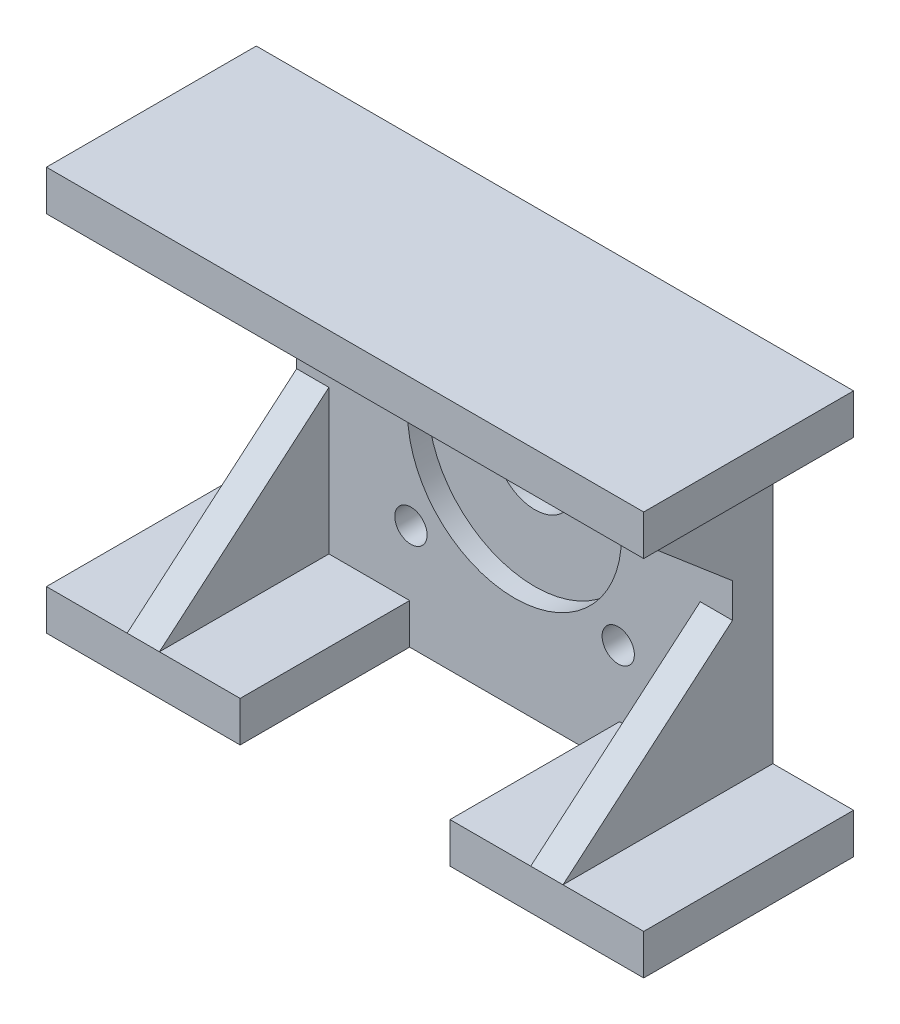
ISO-10303-21;
HEADER;
FILE_DESCRIPTION(('STEP AP214'),'2;1');
FILE_NAME('part.step','',(''),(''),'','','');
FILE_SCHEMA(('AUTOMOTIVE_DESIGN { 1 0 10303 214 1 1 1 1 }'));
ENDSEC;
DATA;
#1=APPLICATION_CONTEXT('core data for automotive mechanical design processes');
#2=APPLICATION_PROTOCOL_DEFINITION('international standard','automotive_design',2000,#1);
#3=PRODUCT_CONTEXT('',#1,'mechanical');
#4=PRODUCT('Part','Part','',(#3));
#5=PRODUCT_RELATED_PRODUCT_CATEGORY('part','',(#4));
#6=PRODUCT_DEFINITION_FORMATION('','',#4);
#7=PRODUCT_DEFINITION_CONTEXT('part definition',#1,'design');
#8=PRODUCT_DEFINITION('design','',#6,#7);
#9=PRODUCT_DEFINITION_SHAPE('','',#8);
#10=(LENGTH_UNIT() NAMED_UNIT(*) SI_UNIT(.MILLI.,.METRE.));
#11=(NAMED_UNIT(*) PLANE_ANGLE_UNIT() SI_UNIT($,.RADIAN.));
#12=(NAMED_UNIT(*) SI_UNIT($,.STERADIAN.) SOLID_ANGLE_UNIT());
#13=UNCERTAINTY_MEASURE_WITH_UNIT(LENGTH_MEASURE(1.E-05),#10,'distance_accuracy_value','');
#14=(GEOMETRIC_REPRESENTATION_CONTEXT(3) GLOBAL_UNCERTAINTY_ASSIGNED_CONTEXT((#13)) GLOBAL_UNIT_ASSIGNED_CONTEXT((#10,
#11,#12)) REPRESENTATION_CONTEXT('',''));
#15=CARTESIAN_POINT('',(0.,0.,0.));
#16=DIRECTION('',(0.,0.,1.));
#17=DIRECTION('',(1.,0.,0.));
#18=AXIS2_PLACEMENT_3D('',#15,#16,#17);
#19=CARTESIAN_POINT('',(0.,-20.,26.));
#20=DIRECTION('',(0.,1.,0.));
#21=DIRECTION('',(-1.,0.,0.));
#22=AXIS2_PLACEMENT_3D('',#19,#20,#21);
#23=PLANE('',#22);
#24=DIRECTION('',(1.,0.,0.));
#25=VECTOR('',#24,1.);
#26=CARTESIAN_POINT('',(0.,-20.,26.));
#27=LINE('',#26,#25);
#28=CARTESIAN_POINT('',(-37.,-20.,26.));
#29=VERTEX_POINT('',#28);
#30=CARTESIAN_POINT('',(-27.,-20.,26.));
#31=VERTEX_POINT('',#30);
#32=EDGE_CURVE('E220',#29,#31,#27,.T.);
#33=ORIENTED_EDGE('',*,*,#32,.T.);
#34=DIRECTION('',(0.,0.,1.));
#35=VECTOR('',#34,1.);
#36=CARTESIAN_POINT('',(-27.,-20.,0.));
#37=LINE('',#36,#35);
#38=CARTESIAN_POINT('',(-27.,-20.,0.));
#39=VERTEX_POINT('',#38);
#40=EDGE_CURVE('E304',#39,#31,#37,.T.);
#41=ORIENTED_EDGE('',*,*,#40,.F.);
#42=DIRECTION('',(1.,0.,0.));
#43=VECTOR('',#42,1.);
#44=CARTESIAN_POINT('',(0.,-20.,0.));
#45=LINE('',#44,#43);
#46=CARTESIAN_POINT('',(-37.,-20.,0.));
#47=VERTEX_POINT('',#46);
#48=EDGE_CURVE('E301',#47,#39,#45,.T.);
#49=ORIENTED_EDGE('',*,*,#48,.F.);
#50=DIRECTION('',(0.,0.,-1.));
#51=VECTOR('',#50,1.);
#52=CARTESIAN_POINT('',(-37.,-20.,26.));
#53=LINE('',#52,#51);
#54=EDGE_CURVE('E393',#29,#47,#53,.T.);
#55=ORIENTED_EDGE('',*,*,#54,.F.);
#56=EDGE_LOOP('',(#33,#41,#49,#55));
#57=FACE_BOUND('',#56,.T.);
#58=ADVANCED_FACE('F47',(#57),#23,.T.);
#59=CARTESIAN_POINT('',(0.,20.,26.));
#60=DIRECTION('',(0.,1.,0.));
#61=DIRECTION('',(0.,0.,1.));
#62=AXIS2_PLACEMENT_3D('',#59,#60,#61);
#63=PLANE('',#62);
#64=DIRECTION('',(0.,0.,1.));
#65=VECTOR('',#64,1.);
#66=CARTESIAN_POINT('',(-23.,20.,26.));
#67=LINE('',#66,#65);
#68=CARTESIAN_POINT('',(-23.,20.,5.));
#69=VERTEX_POINT('',#68);
#70=CARTESIAN_POINT('',(-23.,20.,26.));
#71=VERTEX_POINT('',#70);
#72=EDGE_CURVE('E243',#69,#71,#67,.T.);
#73=ORIENTED_EDGE('',*,*,#72,.F.);
#74=DIRECTION('',(1.,0.,0.));
#75=VECTOR('',#74,1.);
#76=CARTESIAN_POINT('',(0.,20.,5.));
#77=LINE('',#76,#75);
#78=CARTESIAN_POINT('',(23.,20.,5.));
#79=VERTEX_POINT('',#78);
#80=EDGE_CURVE('E327',#69,#79,#77,.T.);
#81=ORIENTED_EDGE('',*,*,#80,.T.);
#82=DIRECTION('',(0.,0.,1.));
#83=VECTOR('',#82,1.);
#84=CARTESIAN_POINT('',(23.,20.,26.));
#85=LINE('',#84,#83);
#86=CARTESIAN_POINT('',(23.,20.,26.));
#87=VERTEX_POINT('',#86);
#88=EDGE_CURVE('E276',#79,#87,#85,.T.);
#89=ORIENTED_EDGE('',*,*,#88,.T.);
#90=DIRECTION('',(1.,0.,0.));
#91=VECTOR('',#90,1.);
#92=CARTESIAN_POINT('',(0.,20.,26.));
#93=LINE('',#92,#91);
#94=EDGE_CURVE('E338',#71,#87,#93,.T.);
#95=ORIENTED_EDGE('',*,*,#94,.F.);
#96=EDGE_LOOP('',(#73,#81,#89,#95));
#97=FACE_BOUND('',#96,.T.);
#98=ADVANCED_FACE('F530',(#97),#63,.F.);
#99=CARTESIAN_POINT('',(0.,-20.,26.));
#100=DIRECTION('',(0.,-1.,0.));
#101=DIRECTION('',(1.,0.,0.));
#102=AXIS2_PLACEMENT_3D('',#99,#100,#101);
#103=PLANE('',#102);
#104=DIRECTION('',(0.,0.,-1.));
#105=VECTOR('',#104,1.);
#106=CARTESIAN_POINT('',(23.,-20.0000000000001,25.9999999999999));
#107=LINE('',#106,#105);
#108=CARTESIAN_POINT('',(23.,-20.,26.));
#109=VERTEX_POINT('',#108);
#110=CARTESIAN_POINT('',(23.,-20.,4.99999999999994));
#111=VERTEX_POINT('',#110);
#112=EDGE_CURVE('E272',#109,#111,#107,.T.);
#113=ORIENTED_EDGE('',*,*,#112,.T.);
#114=DIRECTION('',(-1.,0.,0.));
#115=VECTOR('',#114,1.);
#116=CARTESIAN_POINT('',(0.,-20.,5.));
#117=LINE('',#116,#115);
#118=CARTESIAN_POINT('',(13.,-20.,5.));
#119=VERTEX_POINT('',#118);
#120=EDGE_CURVE('E352',#111,#119,#117,.T.);
#121=ORIENTED_EDGE('',*,*,#120,.T.);
#122=DIRECTION('',(0.,0.,-1.));
#123=VECTOR('',#122,1.);
#124=CARTESIAN_POINT('',(13.,-20.,26.));
#125=LINE('',#124,#123);
#126=CARTESIAN_POINT('',(13.,-20.,26.));
#127=VERTEX_POINT('',#126);
#128=EDGE_CURVE('E371',#127,#119,#125,.T.);
#129=ORIENTED_EDGE('',*,*,#128,.F.);
#130=DIRECTION('',(-1.,0.,0.));
#131=VECTOR('',#130,1.);
#132=CARTESIAN_POINT('',(0.,-20.,26.));
#133=LINE('',#132,#131);
#134=EDGE_CURVE('E359',#109,#127,#133,.T.);
#135=ORIENTED_EDGE('',*,*,#134,.F.);
#136=EDGE_LOOP('',(#113,#121,#129,#135));
#137=FACE_BOUND('',#136,.T.);
#138=ADVANCED_FACE('F528',(#137),#103,.F.);
#139=CARTESIAN_POINT('',(27.,20.,26.));
#140=VERTEX_POINT('',#139);
#141=CARTESIAN_POINT('',(37.,20.,26.));
#142=VERTEX_POINT('',#141);
#143=EDGE_CURVE('E333',#140,#142,#93,.T.);
#144=ORIENTED_EDGE('',*,*,#143,.F.);
#145=DIRECTION('',(0.,0.,1.));
#146=VECTOR('',#145,1.);
#147=CARTESIAN_POINT('',(27.,20.,5.));
#148=LINE('',#147,#146);
#149=CARTESIAN_POINT('',(27.,20.,0.));
#150=VERTEX_POINT('',#149);
#151=EDGE_CURVE('E325',#150,#140,#148,.T.);
#152=ORIENTED_EDGE('',*,*,#151,.F.);
#153=DIRECTION('',(1.,0.,0.));
#154=VECTOR('',#153,1.);
#155=CARTESIAN_POINT('',(-37.,20.,0.));
#156=LINE('',#155,#154);
#157=CARTESIAN_POINT('',(37.,20.,0.));
#158=VERTEX_POINT('',#157);
#159=EDGE_CURVE('E316',#150,#158,#156,.T.);
#160=ORIENTED_EDGE('',*,*,#159,.T.);
#161=DIRECTION('',(0.,0.,-1.));
#162=VECTOR('',#161,1.);
#163=CARTESIAN_POINT('',(37.,20.,26.));
#164=LINE('',#163,#162);
#165=EDGE_CURVE('E345',#142,#158,#164,.T.);
#166=ORIENTED_EDGE('',*,*,#165,.F.);
#167=EDGE_LOOP('',(#144,#152,#160,#166));
#168=FACE_BOUND('',#167,.T.);
#169=ADVANCED_FACE('F513',(#168),#63,.F.);
#170=CARTESIAN_POINT('',(0.,0.,5.));
#171=DIRECTION('',(0.,0.,-1.));
#172=DIRECTION('',(-1.,0.,0.));
#173=AXIS2_PLACEMENT_3D('',#170,#171,#172);
#174=CYLINDRICAL_SURFACE('',#173,5.);
#175=CARTESIAN_POINT('',(0.,0.,0.));
#176=DIRECTION('',(0.,0.,1.));
#177=DIRECTION('',(1.,0.,0.));
#178=AXIS2_PLACEMENT_3D('',#175,#176,#177);
#179=CIRCLE('',#178,5.);
#180=CARTESIAN_POINT('',(5.,0.,0.));
#181=VERTEX_POINT('',#180);
#182=EDGE_CURVE('E419',#181,#181,#179,.T.);
#183=ORIENTED_EDGE('',*,*,#182,.F.);
#184=EDGE_LOOP('',(#183));
#185=FACE_BOUND('',#184,.T.);
#186=CARTESIAN_POINT('',(0.,0.,2.5));
#187=DIRECTION('',(0.,0.,1.));
#188=DIRECTION('',(1.,0.,0.));
#189=AXIS2_PLACEMENT_3D('',#186,#187,#188);
#190=CIRCLE('',#189,5.);
#191=CARTESIAN_POINT('',(5.,0.,2.5));
#192=VERTEX_POINT('',#191);
#193=EDGE_CURVE('E51',#192,#192,#190,.T.);
#194=ORIENTED_EDGE('',*,*,#193,.T.);
#195=EDGE_LOOP('',(#194));
#196=FACE_BOUND('',#195,.T.);
#197=ADVANCED_FACE('F536',(#185,#196),#174,.F.);
#198=CARTESIAN_POINT('',(-27.,25.,5.));
#199=DIRECTION('',(1.,0.,0.));
#200=DIRECTION('',(0.,1.,0.));
#201=AXIS2_PLACEMENT_3D('',#198,#199,#200);
#202=PLANE('',#201);
#203=ORIENTED_EDGE('',*,*,#40,.T.);
#204=DIRECTION('',(0.,-0.64813639465699,0.761524270080107));
#205=VECTOR('',#204,1.);
#206=CARTESIAN_POINT('',(-27.,-20.0000000000001,25.9999999999999));
#207=LINE('',#206,#205);
#208=CARTESIAN_POINT('',(-27.,-2.12681483366914,5.));
#209=VERTEX_POINT('',#208);
#210=EDGE_CURVE('E236',#209,#31,#207,.T.);
#211=ORIENTED_EDGE('',*,*,#210,.F.);
#212=DIRECTION('',(0.,-1.,0.));
#213=VECTOR('',#212,1.);
#214=CARTESIAN_POINT('',(-27.,25.,5.));
#215=LINE('',#214,#213);
#216=CARTESIAN_POINT('',(-27.,2.12681483366911,5.));
#217=VERTEX_POINT('',#216);
#218=EDGE_CURVE('E69',#217,#209,#215,.T.);
#219=ORIENTED_EDGE('',*,*,#218,.F.);
#220=DIRECTION('',(0.,-0.648136394656988,-0.761524270080108));
#221=VECTOR('',#220,1.);
#222=CARTESIAN_POINT('',(-27.,20.,26.));
#223=LINE('',#222,#221);
#224=CARTESIAN_POINT('',(-27.,20.,26.));
#225=VERTEX_POINT('',#224);
#226=EDGE_CURVE('E245',#225,#217,#223,.T.);
#227=ORIENTED_EDGE('',*,*,#226,.F.);
#228=DIRECTION('',(0.,0.,-1.));
#229=VECTOR('',#228,1.);
#230=CARTESIAN_POINT('',(-27.,20.,5.));
#231=LINE('',#230,#229);
#232=CARTESIAN_POINT('',(-27.,20.,0.));
#233=VERTEX_POINT('',#232);
#234=EDGE_CURVE('E322',#225,#233,#231,.T.);
#235=ORIENTED_EDGE('',*,*,#234,.T.);
#236=DIRECTION('',(0.,-1.,0.));
#237=VECTOR('',#236,1.);
#238=CARTESIAN_POINT('',(-27.,25.,0.));
#239=LINE('',#238,#237);
#240=EDGE_CURVE('E433',#233,#39,#239,.T.);
#241=ORIENTED_EDGE('',*,*,#240,.T.);
#242=EDGE_LOOP('',(#203,#211,#219,#227,#235,#241));
#243=FACE_BOUND('',#242,.T.);
#244=ADVANCED_FACE('F484',(#243),#202,.F.);
#245=CARTESIAN_POINT('',(0.,0.,5.));
#246=DIRECTION('',(0.,0.,1.));
#247=DIRECTION('',(1.,0.,0.));
#248=AXIS2_PLACEMENT_3D('',#245,#246,#247);
#249=PLANE('',#248);
#250=DIRECTION('',(1.,0.,0.));
#251=VECTOR('',#250,1.);
#252=CARTESIAN_POINT('',(-27.,-2.12681483366913,4.99999999999999));
#253=LINE('',#252,#251);
#254=CARTESIAN_POINT('',(-23.,-2.12681483366914,5.));
#255=VERTEX_POINT('',#254);
#256=EDGE_CURVE('E64',#209,#255,#253,.T.);
#257=ORIENTED_EDGE('',*,*,#256,.T.);
#258=DIRECTION('',(0.,1.,0.));
#259=VECTOR('',#258,1.);
#260=CARTESIAN_POINT('',(-23.,-20.,4.99999999999994));
#261=LINE('',#260,#259);
#262=CARTESIAN_POINT('',(-23.,-20.,5.));
#263=VERTEX_POINT('',#262);
#264=EDGE_CURVE('E229',#263,#255,#261,.T.);
#265=ORIENTED_EDGE('',*,*,#264,.F.);
#266=DIRECTION('',(1.,0.,0.));
#267=VECTOR('',#266,1.);
#268=CARTESIAN_POINT('',(0.,-20.,5.));
#269=LINE('',#268,#267);
#270=CARTESIAN_POINT('',(-13.,-20.,5.));
#271=VERTEX_POINT('',#270);
#272=EDGE_CURVE('E11',#263,#271,#269,.T.);
#273=ORIENTED_EDGE('',*,*,#272,.T.);
#274=DIRECTION('',(0.,-1.,0.));
#275=VECTOR('',#274,1.);
#276=CARTESIAN_POINT('',(-13.,0.,5.));
#277=LINE('',#276,#275);
#278=CARTESIAN_POINT('',(-13.,-25.,5.));
#279=VERTEX_POINT('',#278);
#280=EDGE_CURVE('E379',#271,#279,#277,.T.);
#281=ORIENTED_EDGE('',*,*,#280,.T.);
#282=DIRECTION('',(1.,0.,0.));
#283=VECTOR('',#282,1.);
#284=CARTESIAN_POINT('',(-27.,-25.,5.));
#285=LINE('',#284,#283);
#286=CARTESIAN_POINT('',(13.,-25.,5.));
#287=VERTEX_POINT('',#286);
#288=EDGE_CURVE('E56',#279,#287,#285,.T.);
#289=ORIENTED_EDGE('',*,*,#288,.T.);
#290=DIRECTION('',(0.,-1.,0.));
#291=VECTOR('',#290,1.);
#292=CARTESIAN_POINT('',(13.,0.,5.));
#293=LINE('',#292,#291);
#294=EDGE_CURVE('E357',#119,#287,#293,.T.);
#295=ORIENTED_EDGE('',*,*,#294,.F.);
#296=ORIENTED_EDGE('',*,*,#120,.F.);
#297=DIRECTION('',(0.,1.,0.));
#298=VECTOR('',#297,1.);
#299=CARTESIAN_POINT('',(23.,-20.,4.99999999999994));
#300=LINE('',#299,#298);
#301=CARTESIAN_POINT('',(23.,-2.12681483366913,4.99999999999999));
#302=VERTEX_POINT('',#301);
#303=EDGE_CURVE('E262',#111,#302,#300,.T.);
#304=ORIENTED_EDGE('',*,*,#303,.T.);
#305=DIRECTION('',(1.,0.,0.));
#306=VECTOR('',#305,1.);
#307=CARTESIAN_POINT('',(23.,-2.12681483366913,4.99999999999999));
#308=LINE('',#307,#306);
#309=CARTESIAN_POINT('',(27.,-2.12681483366913,4.99999999999999));
#310=VERTEX_POINT('',#309);
#311=EDGE_CURVE('E256',#302,#310,#308,.T.);
#312=ORIENTED_EDGE('',*,*,#311,.T.);
#313=DIRECTION('',(0.,1.,0.));
#314=VECTOR('',#313,1.);
#315=CARTESIAN_POINT('',(27.,25.,5.));
#316=LINE('',#315,#314);
#317=CARTESIAN_POINT('',(27.,2.12681483366912,5.));
#318=VERTEX_POINT('',#317);
#319=EDGE_CURVE('E425',#310,#318,#316,.T.);
#320=ORIENTED_EDGE('',*,*,#319,.T.);
#321=DIRECTION('',(1.,0.,0.));
#322=VECTOR('',#321,1.);
#323=CARTESIAN_POINT('',(23.,2.12681483366912,5.));
#324=LINE('',#323,#322);
#325=CARTESIAN_POINT('',(23.,2.12681483366912,5.));
#326=VERTEX_POINT('',#325);
#327=EDGE_CURVE('E287',#326,#318,#324,.T.);
#328=ORIENTED_EDGE('',*,*,#327,.F.);
#329=DIRECTION('',(0.,1.,0.));
#330=VECTOR('',#329,1.);
#331=CARTESIAN_POINT('',(23.,20.,5.));
#332=LINE('',#331,#330);
#333=EDGE_CURVE('E281',#326,#79,#332,.T.);
#334=ORIENTED_EDGE('',*,*,#333,.T.);
#335=ORIENTED_EDGE('',*,*,#80,.F.);
#336=DIRECTION('',(0.,1.,0.));
#337=VECTOR('',#336,1.);
#338=CARTESIAN_POINT('',(-23.,20.,5.));
#339=LINE('',#338,#337);
#340=CARTESIAN_POINT('',(-23.,2.12681483366911,5.));
#341=VERTEX_POINT('',#340);
#342=EDGE_CURVE('E248',#341,#69,#339,.T.);
#343=ORIENTED_EDGE('',*,*,#342,.F.);
#344=DIRECTION('',(1.,0.,0.));
#345=VECTOR('',#344,1.);
#346=CARTESIAN_POINT('',(-27.,2.12681483366911,5.));
#347=LINE('',#346,#345);
#348=EDGE_CURVE('E254',#217,#341,#347,.T.);
#349=ORIENTED_EDGE('',*,*,#348,.F.);
#350=ORIENTED_EDGE('',*,*,#218,.T.);
#351=EDGE_LOOP('',(#257,#265,#273,#281,#289,#295,#296,#304,#312,#320,#328,#334,#335,#343,#349,#350));
#352=FACE_BOUND('',#351,.T.);
#353=CARTESIAN_POINT('',(0.,0.,5.));
#354=DIRECTION('',(0.,0.,1.));
#355=DIRECTION('',(1.,0.,0.));
#356=AXIS2_PLACEMENT_3D('',#353,#354,#355);
#357=CIRCLE('',#356,13.25);
#358=CARTESIAN_POINT('',(13.25,0.,5.));
#359=VERTEX_POINT('',#358);
#360=EDGE_CURVE('E290',#359,#359,#357,.T.);
#361=ORIENTED_EDGE('',*,*,#360,.F.);
#362=EDGE_LOOP('',(#361));
#363=FACE_BOUND('',#362,.T.);
#364=CARTESIAN_POINT('',(12.840811795318,-11.8896405512203,5.));
#365=DIRECTION('',(0.,0.,1.));
#366=DIRECTION('',(1.,0.,0.));
#367=AXIS2_PLACEMENT_3D('',#364,#365,#366);
#368=CIRCLE('',#367,2.);
#369=CARTESIAN_POINT('',(14.840811795318,-11.8896405512203,5.));
#370=VERTEX_POINT('',#369);
#371=EDGE_CURVE('E404',#370,#370,#368,.T.);
#372=ORIENTED_EDGE('',*,*,#371,.F.);
#373=EDGE_LOOP('',(#372));
#374=FACE_BOUND('',#373,.T.);
#375=CARTESIAN_POINT('',(-12.840811795318,11.8896405512203,5.));
#376=DIRECTION('',(0.,0.,1.));
#377=DIRECTION('',(1.,0.,0.));
#378=AXIS2_PLACEMENT_3D('',#375,#376,#377);
#379=CIRCLE('',#378,2.);
#380=CARTESIAN_POINT('',(-10.840811795318,11.8896405512203,5.));
#381=VERTEX_POINT('',#380);
#382=EDGE_CURVE('E416',#381,#381,#379,.T.);
#383=ORIENTED_EDGE('',*,*,#382,.F.);
#384=EDGE_LOOP('',(#383));
#385=FACE_BOUND('',#384,.T.);
#386=CARTESIAN_POINT('',(-12.840811795318,-11.8896405512203,5.));
#387=DIRECTION('',(0.,0.,1.));
#388=DIRECTION('',(-1.,0.,0.));
#389=AXIS2_PLACEMENT_3D('',#386,#387,#388);
#390=CIRCLE('',#389,2.);
#391=CARTESIAN_POINT('',(-14.840811795318,-11.8896405512203,5.));
#392=VERTEX_POINT('',#391);
#393=EDGE_CURVE('E410',#392,#392,#390,.T.);
#394=ORIENTED_EDGE('',*,*,#393,.F.);
#395=EDGE_LOOP('',(#394));
#396=FACE_BOUND('',#395,.T.);
#397=CARTESIAN_POINT('',(12.840811795318,11.8896405512203,5.));
#398=DIRECTION('',(0.,0.,1.));
#399=DIRECTION('',(-1.,0.,0.));
#400=AXIS2_PLACEMENT_3D('',#397,#398,#399);
#401=CIRCLE('',#400,2.);
#402=CARTESIAN_POINT('',(10.840811795318,11.8896405512203,5.));
#403=VERTEX_POINT('',#402);
#404=EDGE_CURVE('E398',#403,#403,#401,.T.);
#405=ORIENTED_EDGE('',*,*,#404,.F.);
#406=EDGE_LOOP('',(#405));
#407=FACE_BOUND('',#406,.T.);
#408=ADVANCED_FACE('F471',(#352,#363,#374,#385,#396,#407),#249,.T.);
#409=CARTESIAN_POINT('',(0.,0.,0.));
#410=DIRECTION('',(0.,0.,1.));
#411=DIRECTION('',(1.,0.,0.));
#412=AXIS2_PLACEMENT_3D('',#409,#410,#411);
#413=PLANE('',#412);
#414=ORIENTED_EDGE('',*,*,#240,.F.);
#415=CARTESIAN_POINT('',(-37.,20.,0.));
#416=VERTEX_POINT('',#415);
#417=EDGE_CURVE('E317',#416,#233,#156,.T.);
#418=ORIENTED_EDGE('',*,*,#417,.F.);
#419=DIRECTION('',(0.,-1.,0.));
#420=VECTOR('',#419,1.);
#421=CARTESIAN_POINT('',(-37.,25.,0.));
#422=LINE('',#421,#420);
#423=CARTESIAN_POINT('',(-37.,25.,0.));
#424=VERTEX_POINT('',#423);
#425=EDGE_CURVE('E319',#424,#416,#422,.T.);
#426=ORIENTED_EDGE('',*,*,#425,.F.);
#427=DIRECTION('',(-1.,0.,0.));
#428=VECTOR('',#427,1.);
#429=CARTESIAN_POINT('',(-27.,25.,0.));
#430=LINE('',#429,#428);
#431=CARTESIAN_POINT('',(37.,25.,0.));
#432=VERTEX_POINT('',#431);
#433=EDGE_CURVE('E431',#432,#424,#430,.T.);
#434=ORIENTED_EDGE('',*,*,#433,.F.);
#435=DIRECTION('',(0.,-1.,0.));
#436=VECTOR('',#435,1.);
#437=CARTESIAN_POINT('',(37.,25.,0.));
#438=LINE('',#437,#436);
#439=EDGE_CURVE('E313',#432,#158,#438,.T.);
#440=ORIENTED_EDGE('',*,*,#439,.T.);
#441=ORIENTED_EDGE('',*,*,#159,.F.);
#442=DIRECTION('',(0.,1.,0.));
#443=VECTOR('',#442,1.);
#444=CARTESIAN_POINT('',(27.,25.,0.));
#445=LINE('',#444,#443);
#446=CARTESIAN_POINT('',(27.,-20.,0.));
#447=VERTEX_POINT('',#446);
#448=EDGE_CURVE('E424',#447,#150,#445,.T.);
#449=ORIENTED_EDGE('',*,*,#448,.F.);
#450=DIRECTION('',(-1.,0.,0.));
#451=VECTOR('',#450,1.);
#452=CARTESIAN_POINT('',(0.,-20.,0.));
#453=LINE('',#452,#451);
#454=CARTESIAN_POINT('',(37.,-20.,0.));
#455=VERTEX_POINT('',#454);
#456=EDGE_CURVE('E309',#455,#447,#453,.T.);
#457=ORIENTED_EDGE('',*,*,#456,.F.);
#458=DIRECTION('',(0.,1.,0.));
#459=VECTOR('',#458,1.);
#460=CARTESIAN_POINT('',(37.,0.,0.));
#461=LINE('',#460,#459);
#462=CARTESIAN_POINT('',(37.,-25.,0.));
#463=VERTEX_POINT('',#462);
#464=EDGE_CURVE('E306',#463,#455,#461,.T.);
#465=ORIENTED_EDGE('',*,*,#464,.F.);
#466=DIRECTION('',(1.,0.,0.));
#467=VECTOR('',#466,1.);
#468=CARTESIAN_POINT('',(-27.,-25.,0.));
#469=LINE('',#468,#467);
#470=CARTESIAN_POINT('',(-37.,-25.,0.));
#471=VERTEX_POINT('',#470);
#472=EDGE_CURVE('E427',#471,#463,#469,.T.);
#473=ORIENTED_EDGE('',*,*,#472,.F.);
#474=DIRECTION('',(0.,1.,0.));
#475=VECTOR('',#474,1.);
#476=CARTESIAN_POINT('',(-37.,0.,0.));
#477=LINE('',#476,#475);
#478=EDGE_CURVE('E298',#471,#47,#477,.T.);
#479=ORIENTED_EDGE('',*,*,#478,.T.);
#480=ORIENTED_EDGE('',*,*,#48,.T.);
#481=EDGE_LOOP('',(#414,#418,#426,#434,#440,#441,#449,#457,#465,#473,#479,#480));
#482=FACE_BOUND('',#481,.T.);
#483=ORIENTED_EDGE('',*,*,#182,.T.);
#484=EDGE_LOOP('',(#483));
#485=FACE_BOUND('',#484,.T.);
#486=CARTESIAN_POINT('',(-12.840811795318,11.8896405512203,0.));
#487=DIRECTION('',(0.,0.,1.));
#488=DIRECTION('',(1.,0.,0.));
#489=AXIS2_PLACEMENT_3D('',#486,#487,#488);
#490=CIRCLE('',#489,2.);
#491=CARTESIAN_POINT('',(-10.840811795318,11.8896405512203,0.));
#492=VERTEX_POINT('',#491);
#493=EDGE_CURVE('E413',#492,#492,#490,.T.);
#494=ORIENTED_EDGE('',*,*,#493,.T.);
#495=EDGE_LOOP('',(#494));
#496=FACE_BOUND('',#495,.T.);
#497=CARTESIAN_POINT('',(-12.840811795318,-11.8896405512203,0.));
#498=DIRECTION('',(0.,0.,1.));
#499=DIRECTION('',(-1.,0.,0.));
#500=AXIS2_PLACEMENT_3D('',#497,#498,#499);
#501=CIRCLE('',#500,2.);
#502=CARTESIAN_POINT('',(-14.840811795318,-11.8896405512203,0.));
#503=VERTEX_POINT('',#502);
#504=EDGE_CURVE('E407',#503,#503,#501,.T.);
#505=ORIENTED_EDGE('',*,*,#504,.T.);
#506=EDGE_LOOP('',(#505));
#507=FACE_BOUND('',#506,.T.);
#508=CARTESIAN_POINT('',(12.840811795318,-11.8896405512203,0.));
#509=DIRECTION('',(0.,0.,1.));
#510=DIRECTION('',(1.,0.,0.));
#511=AXIS2_PLACEMENT_3D('',#508,#509,#510);
#512=CIRCLE('',#511,2.);
#513=CARTESIAN_POINT('',(14.840811795318,-11.8896405512203,0.));
#514=VERTEX_POINT('',#513);
#515=EDGE_CURVE('E401',#514,#514,#512,.T.);
#516=ORIENTED_EDGE('',*,*,#515,.T.);
#517=EDGE_LOOP('',(#516));
#518=FACE_BOUND('',#517,.T.);
#519=CARTESIAN_POINT('',(12.840811795318,11.8896405512203,0.));
#520=DIRECTION('',(0.,0.,1.));
#521=DIRECTION('',(-1.,0.,0.));
#522=AXIS2_PLACEMENT_3D('',#519,#520,#521);
#523=CIRCLE('',#522,2.);
#524=CARTESIAN_POINT('',(10.840811795318,11.8896405512203,0.));
#525=VERTEX_POINT('',#524);
#526=EDGE_CURVE('E397',#525,#525,#523,.T.);
#527=ORIENTED_EDGE('',*,*,#526,.T.);
#528=EDGE_LOOP('',(#527));
#529=FACE_BOUND('',#528,.T.);
#530=ADVANCED_FACE('F447',(#482,#485,#496,#507,#518,#529),#413,.F.);
#531=CARTESIAN_POINT('',(27.,25.,5.));
#532=DIRECTION('',(-1.,0.,0.));
#533=DIRECTION('',(0.,-1.,0.));
#534=AXIS2_PLACEMENT_3D('',#531,#532,#533);
#535=PLANE('',#534);
#536=ORIENTED_EDGE('',*,*,#319,.F.);
#537=DIRECTION('',(0.,-0.64813639465699,0.761524270080107));
#538=VECTOR('',#537,1.);
#539=CARTESIAN_POINT('',(27.,-20.0000000000001,25.9999999999999));
#540=LINE('',#539,#538);
#541=CARTESIAN_POINT('',(27.,-20.0000000000001,25.9999999999999));
#542=VERTEX_POINT('',#541);
#543=EDGE_CURVE('E265',#310,#542,#540,.T.);
#544=ORIENTED_EDGE('',*,*,#543,.T.);
#545=DIRECTION('',(0.,0.,1.));
#546=VECTOR('',#545,1.);
#547=CARTESIAN_POINT('',(27.,-20.,0.));
#548=LINE('',#547,#546);
#549=EDGE_CURVE('E311',#447,#542,#548,.T.);
#550=ORIENTED_EDGE('',*,*,#549,.F.);
#551=ORIENTED_EDGE('',*,*,#448,.T.);
#552=ORIENTED_EDGE('',*,*,#151,.T.);
#553=DIRECTION('',(0.,-0.648136394656988,-0.761524270080108));
#554=VECTOR('',#553,1.);
#555=CARTESIAN_POINT('',(27.,20.,26.));
#556=LINE('',#555,#554);
#557=EDGE_CURVE('E268',#140,#318,#556,.T.);
#558=ORIENTED_EDGE('',*,*,#557,.T.);
#559=EDGE_LOOP('',(#536,#544,#550,#551,#552,#558));
#560=FACE_BOUND('',#559,.T.);
#561=ADVANCED_FACE('F49',(#560),#535,.F.);
#562=CARTESIAN_POINT('',(-27.,25.,5.));
#563=DIRECTION('',(0.,-1.,0.));
#564=DIRECTION('',(0.,0.,-1.));
#565=AXIS2_PLACEMENT_3D('',#562,#563,#564);
#566=PLANE('',#565);
#567=DIRECTION('',(0.,0.,-1.));
#568=VECTOR('',#567,1.);
#569=CARTESIAN_POINT('',(37.,25.,26.));
#570=LINE('',#569,#568);
#571=CARTESIAN_POINT('',(37.,25.,26.));
#572=VERTEX_POINT('',#571);
#573=EDGE_CURVE('E341',#572,#432,#570,.T.);
#574=ORIENTED_EDGE('',*,*,#573,.T.);
#575=ORIENTED_EDGE('',*,*,#433,.T.);
#576=DIRECTION('',(0.,0.,-1.));
#577=VECTOR('',#576,1.);
#578=CARTESIAN_POINT('',(-37.,25.,26.));
#579=LINE('',#578,#577);
#580=CARTESIAN_POINT('',(-37.,25.,26.));
#581=VERTEX_POINT('',#580);
#582=EDGE_CURVE('E349',#581,#424,#579,.T.);
#583=ORIENTED_EDGE('',*,*,#582,.F.);
#584=DIRECTION('',(-1.,0.,0.));
#585=VECTOR('',#584,1.);
#586=CARTESIAN_POINT('',(0.,25.,26.));
#587=LINE('',#586,#585);
#588=EDGE_CURVE('E328',#572,#581,#587,.T.);
#589=ORIENTED_EDGE('',*,*,#588,.F.);
#590=EDGE_LOOP('',(#574,#575,#583,#589));
#591=FACE_BOUND('',#590,.T.);
#592=ADVANCED_FACE('F506',(#591),#566,.F.);
#593=CARTESIAN_POINT('',(-27.,-25.,5.));
#594=DIRECTION('',(0.,1.,0.));
#595=DIRECTION('',(0.,0.,1.));
#596=AXIS2_PLACEMENT_3D('',#593,#594,#595);
#597=PLANE('',#596);
#598=DIRECTION('',(0.,0.,-1.));
#599=VECTOR('',#598,1.);
#600=CARTESIAN_POINT('',(-37.,-25.,26.));
#601=LINE('',#600,#599);
#602=CARTESIAN_POINT('',(-37.,-25.,26.));
#603=VERTEX_POINT('',#602);
#604=EDGE_CURVE('E390',#603,#471,#601,.T.);
#605=ORIENTED_EDGE('',*,*,#604,.T.);
#606=ORIENTED_EDGE('',*,*,#472,.T.);
#607=DIRECTION('',(0.,0.,-1.));
#608=VECTOR('',#607,1.);
#609=CARTESIAN_POINT('',(37.,-25.,26.));
#610=LINE('',#609,#608);
#611=CARTESIAN_POINT('',(37.,-25.,26.));
#612=VERTEX_POINT('',#611);
#613=EDGE_CURVE('E376',#612,#463,#610,.T.);
#614=ORIENTED_EDGE('',*,*,#613,.F.);
#615=DIRECTION('',(1.,0.,0.));
#616=VECTOR('',#615,1.);
#617=CARTESIAN_POINT('',(0.,-25.,26.));
#618=LINE('',#617,#616);
#619=CARTESIAN_POINT('',(13.,-25.,26.));
#620=VERTEX_POINT('',#619);
#621=EDGE_CURVE('E353',#620,#612,#618,.T.);
#622=ORIENTED_EDGE('',*,*,#621,.F.);
#623=DIRECTION('',(0.,0.,-1.));
#624=VECTOR('',#623,1.);
#625=CARTESIAN_POINT('',(13.,-25.,26.));
#626=LINE('',#625,#624);
#627=EDGE_CURVE('E365',#620,#287,#626,.T.);
#628=ORIENTED_EDGE('',*,*,#627,.T.);
#629=ORIENTED_EDGE('',*,*,#288,.F.);
#630=DIRECTION('',(0.,0.,-1.));
#631=VECTOR('',#630,1.);
#632=CARTESIAN_POINT('',(-13.,-25.,26.));
#633=LINE('',#632,#631);
#634=CARTESIAN_POINT('',(-13.,-25.,26.));
#635=VERTEX_POINT('',#634);
#636=EDGE_CURVE('E386',#635,#279,#633,.T.);
#637=ORIENTED_EDGE('',*,*,#636,.F.);
#638=DIRECTION('',(1.,0.,0.));
#639=VECTOR('',#638,1.);
#640=CARTESIAN_POINT('',(0.,-25.,26.));
#641=LINE('',#640,#639);
#642=EDGE_CURVE('E384',#603,#635,#641,.T.);
#643=ORIENTED_EDGE('',*,*,#642,.F.);
#644=EDGE_LOOP('',(#605,#606,#614,#622,#628,#629,#637,#643));
#645=FACE_BOUND('',#644,.T.);
#646=ADVANCED_FACE('F436',(#645),#597,.F.);
#647=CARTESIAN_POINT('',(-12.840811795318,11.8896405512203,5.));
#648=DIRECTION('',(0.,0.,-1.));
#649=DIRECTION('',(-1.,0.,0.));
#650=AXIS2_PLACEMENT_3D('',#647,#648,#649);
#651=CYLINDRICAL_SURFACE('',#650,2.);
#652=ORIENTED_EDGE('',*,*,#382,.T.);
#653=EDGE_LOOP('',(#652));
#654=FACE_BOUND('',#653,.T.);
#655=ORIENTED_EDGE('',*,*,#493,.F.);
#656=EDGE_LOOP('',(#655));
#657=FACE_BOUND('',#656,.T.);
#658=ADVANCED_FACE('F572',(#654,#657),#651,.F.);
#659=CARTESIAN_POINT('',(-12.840811795318,-11.8896405512203,5.));
#660=DIRECTION('',(0.,0.,-1.));
#661=DIRECTION('',(-1.,0.,0.));
#662=AXIS2_PLACEMENT_3D('',#659,#660,#661);
#663=CYLINDRICAL_SURFACE('',#662,2.);
#664=ORIENTED_EDGE('',*,*,#393,.T.);
#665=EDGE_LOOP('',(#664));
#666=FACE_BOUND('',#665,.T.);
#667=ORIENTED_EDGE('',*,*,#504,.F.);
#668=EDGE_LOOP('',(#667));
#669=FACE_BOUND('',#668,.T.);
#670=ADVANCED_FACE('F568',(#666,#669),#663,.F.);
#671=CARTESIAN_POINT('',(12.840811795318,-11.8896405512203,5.));
#672=DIRECTION('',(0.,0.,-1.));
#673=DIRECTION('',(-1.,0.,0.));
#674=AXIS2_PLACEMENT_3D('',#671,#672,#673);
#675=CYLINDRICAL_SURFACE('',#674,2.);
#676=ORIENTED_EDGE('',*,*,#371,.T.);
#677=EDGE_LOOP('',(#676));
#678=FACE_BOUND('',#677,.T.);
#679=ORIENTED_EDGE('',*,*,#515,.F.);
#680=EDGE_LOOP('',(#679));
#681=FACE_BOUND('',#680,.T.);
#682=ADVANCED_FACE('F562',(#678,#681),#675,.F.);
#683=CARTESIAN_POINT('',(12.840811795318,11.8896405512203,5.));
#684=DIRECTION('',(0.,0.,-1.));
#685=DIRECTION('',(-1.,0.,0.));
#686=AXIS2_PLACEMENT_3D('',#683,#684,#685);
#687=CYLINDRICAL_SURFACE('',#686,2.);
#688=ORIENTED_EDGE('',*,*,#404,.T.);
#689=EDGE_LOOP('',(#688));
#690=FACE_BOUND('',#689,.T.);
#691=ORIENTED_EDGE('',*,*,#526,.F.);
#692=EDGE_LOOP('',(#691));
#693=FACE_BOUND('',#692,.T.);
#694=ADVANCED_FACE('F557',(#690,#693),#687,.F.);
#695=CARTESIAN_POINT('',(-13.,0.,26.));
#696=DIRECTION('',(1.,0.,0.));
#697=DIRECTION('',(0.,0.,-1.));
#698=AXIS2_PLACEMENT_3D('',#695,#696,#697);
#699=PLANE('',#698);
#700=ORIENTED_EDGE('',*,*,#280,.F.);
#701=DIRECTION('',(0.,0.,-1.));
#702=VECTOR('',#701,1.);
#703=CARTESIAN_POINT('',(-13.,-20.,26.));
#704=LINE('',#703,#702);
#705=CARTESIAN_POINT('',(-13.,-20.,26.));
#706=VERTEX_POINT('',#705);
#707=EDGE_CURVE('E395',#706,#271,#704,.T.);
#708=ORIENTED_EDGE('',*,*,#707,.F.);
#709=DIRECTION('',(0.,-1.,0.));
#710=VECTOR('',#709,1.);
#711=CARTESIAN_POINT('',(-13.,0.,26.));
#712=LINE('',#711,#710);
#713=EDGE_CURVE('E216',#706,#635,#712,.T.);
#714=ORIENTED_EDGE('',*,*,#713,.T.);
#715=ORIENTED_EDGE('',*,*,#636,.T.);
#716=EDGE_LOOP('',(#700,#708,#714,#715));
#717=FACE_BOUND('',#716,.T.);
#718=ADVANCED_FACE('F475',(#717),#699,.T.);
#719=DIRECTION('',(0.,0.,-1.));
#720=VECTOR('',#719,1.);
#721=CARTESIAN_POINT('',(-23.,-20.0000000000001,25.9999999999999));
#722=LINE('',#721,#720);
#723=CARTESIAN_POINT('',(-23.,-20.0000000000001,25.9999999999999));
#724=VERTEX_POINT('',#723);
#725=EDGE_CURVE('E224',#724,#263,#722,.T.);
#726=ORIENTED_EDGE('',*,*,#725,.F.);
#727=EDGE_CURVE('E208',#724,#706,#27,.T.);
#728=ORIENTED_EDGE('',*,*,#727,.T.);
#729=ORIENTED_EDGE('',*,*,#707,.T.);
#730=ORIENTED_EDGE('',*,*,#272,.F.);
#731=EDGE_LOOP('',(#726,#728,#729,#730));
#732=FACE_BOUND('',#731,.T.);
#733=ADVANCED_FACE('F225',(#732),#23,.T.);
#734=CARTESIAN_POINT('',(-37.,0.,26.));
#735=DIRECTION('',(-1.,0.,0.));
#736=DIRECTION('',(0.,0.,1.));
#737=AXIS2_PLACEMENT_3D('',#734,#735,#736);
#738=PLANE('',#737);
#739=ORIENTED_EDGE('',*,*,#54,.T.);
#740=ORIENTED_EDGE('',*,*,#478,.F.);
#741=ORIENTED_EDGE('',*,*,#604,.F.);
#742=DIRECTION('',(0.,1.,0.));
#743=VECTOR('',#742,1.);
#744=CARTESIAN_POINT('',(-37.,0.,26.));
#745=LINE('',#744,#743);
#746=EDGE_CURVE('E381',#603,#29,#745,.T.);
#747=ORIENTED_EDGE('',*,*,#746,.T.);
#748=EDGE_LOOP('',(#739,#740,#741,#747));
#749=FACE_BOUND('',#748,.T.);
#750=ADVANCED_FACE('F478',(#749),#738,.T.);
#751=CARTESIAN_POINT('',(0.,0.,26.));
#752=DIRECTION('',(0.,0.,1.));
#753=DIRECTION('',(1.,0.,0.));
#754=AXIS2_PLACEMENT_3D('',#751,#752,#753);
#755=PLANE('',#754);
#756=ORIENTED_EDGE('',*,*,#713,.F.);
#757=ORIENTED_EDGE('',*,*,#727,.F.);
#758=DIRECTION('',(1.,0.,0.));
#759=VECTOR('',#758,1.);
#760=CARTESIAN_POINT('',(-27.,-20.0000000000001,25.9999999999999));
#761=LINE('',#760,#759);
#762=EDGE_CURVE('E213',#31,#724,#761,.T.);
#763=ORIENTED_EDGE('',*,*,#762,.F.);
#764=ORIENTED_EDGE('',*,*,#32,.F.);
#765=ORIENTED_EDGE('',*,*,#746,.F.);
#766=ORIENTED_EDGE('',*,*,#642,.T.);
#767=EDGE_LOOP('',(#756,#757,#763,#764,#765,#766));
#768=FACE_BOUND('',#767,.T.);
#769=ADVANCED_FACE('F210',(#768),#755,.T.);
#770=CARTESIAN_POINT('',(37.,0.,26.));
#771=DIRECTION('',(-1.,0.,0.));
#772=DIRECTION('',(0.,0.,1.));
#773=AXIS2_PLACEMENT_3D('',#770,#771,#772);
#774=PLANE('',#773);
#775=ORIENTED_EDGE('',*,*,#613,.T.);
#776=ORIENTED_EDGE('',*,*,#464,.T.);
#777=DIRECTION('',(0.,0.,-1.));
#778=VECTOR('',#777,1.);
#779=CARTESIAN_POINT('',(37.,-20.,26.));
#780=LINE('',#779,#778);
#781=CARTESIAN_POINT('',(37.,-20.,26.));
#782=VERTEX_POINT('',#781);
#783=EDGE_CURVE('E374',#782,#455,#780,.T.);
#784=ORIENTED_EDGE('',*,*,#783,.F.);
#785=DIRECTION('',(0.,1.,0.));
#786=VECTOR('',#785,1.);
#787=CARTESIAN_POINT('',(37.,0.,26.));
#788=LINE('',#787,#786);
#789=EDGE_CURVE('E356',#612,#782,#788,.T.);
#790=ORIENTED_EDGE('',*,*,#789,.F.);
#791=EDGE_LOOP('',(#775,#776,#784,#790));
#792=FACE_BOUND('',#791,.T.);
#793=ADVANCED_FACE('F443',(#792),#774,.F.);
#794=ORIENTED_EDGE('',*,*,#549,.T.);
#795=EDGE_CURVE('E360',#782,#542,#133,.T.);
#796=ORIENTED_EDGE('',*,*,#795,.F.);
#797=ORIENTED_EDGE('',*,*,#783,.T.);
#798=ORIENTED_EDGE('',*,*,#456,.T.);
#799=EDGE_LOOP('',(#794,#796,#797,#798));
#800=FACE_BOUND('',#799,.T.);
#801=ADVANCED_FACE('F453',(#800),#103,.F.);
#802=CARTESIAN_POINT('',(13.,0.,26.));
#803=DIRECTION('',(1.,0.,0.));
#804=DIRECTION('',(0.,0.,-1.));
#805=AXIS2_PLACEMENT_3D('',#802,#803,#804);
#806=PLANE('',#805);
#807=ORIENTED_EDGE('',*,*,#294,.T.);
#808=ORIENTED_EDGE('',*,*,#627,.F.);
#809=DIRECTION('',(0.,-1.,0.));
#810=VECTOR('',#809,1.);
#811=CARTESIAN_POINT('',(13.,0.,26.));
#812=LINE('',#811,#810);
#813=EDGE_CURVE('E363',#127,#620,#812,.T.);
#814=ORIENTED_EDGE('',*,*,#813,.F.);
#815=ORIENTED_EDGE('',*,*,#128,.T.);
#816=EDGE_LOOP('',(#807,#808,#814,#815));
#817=FACE_BOUND('',#816,.T.);
#818=ADVANCED_FACE('F467',(#817),#806,.F.);
#819=CARTESIAN_POINT('',(0.,0.,26.));
#820=DIRECTION('',(0.,0.,1.));
#821=DIRECTION('',(1.,0.,0.));
#822=AXIS2_PLACEMENT_3D('',#819,#820,#821);
#823=PLANE('',#822);
#824=ORIENTED_EDGE('',*,*,#621,.T.);
#825=ORIENTED_EDGE('',*,*,#789,.T.);
#826=ORIENTED_EDGE('',*,*,#795,.T.);
#827=DIRECTION('',(1.,0.,0.));
#828=VECTOR('',#827,1.);
#829=CARTESIAN_POINT('',(23.,-20.0000000000001,25.9999999999999));
#830=LINE('',#829,#828);
#831=EDGE_CURVE('E259',#109,#542,#830,.T.);
#832=ORIENTED_EDGE('',*,*,#831,.F.);
#833=ORIENTED_EDGE('',*,*,#134,.T.);
#834=ORIENTED_EDGE('',*,*,#813,.T.);
#835=EDGE_LOOP('',(#824,#825,#826,#832,#833,#834));
#836=FACE_BOUND('',#835,.T.);
#837=ADVANCED_FACE('F461',(#836),#823,.T.);
#838=CARTESIAN_POINT('',(-37.,0.,26.));
#839=DIRECTION('',(1.,0.,0.));
#840=DIRECTION('',(0.,0.,-1.));
#841=AXIS2_PLACEMENT_3D('',#838,#839,#840);
#842=PLANE('',#841);
#843=ORIENTED_EDGE('',*,*,#582,.T.);
#844=ORIENTED_EDGE('',*,*,#425,.T.);
#845=DIRECTION('',(0.,0.,-1.));
#846=VECTOR('',#845,1.);
#847=CARTESIAN_POINT('',(-37.,20.,26.));
#848=LINE('',#847,#846);
#849=CARTESIAN_POINT('',(-37.,20.,26.));
#850=VERTEX_POINT('',#849);
#851=EDGE_CURVE('E347',#850,#416,#848,.T.);
#852=ORIENTED_EDGE('',*,*,#851,.F.);
#853=DIRECTION('',(0.,-1.,0.));
#854=VECTOR('',#853,1.);
#855=CARTESIAN_POINT('',(-37.,0.,26.));
#856=LINE('',#855,#854);
#857=EDGE_CURVE('E331',#581,#850,#856,.T.);
#858=ORIENTED_EDGE('',*,*,#857,.F.);
#859=EDGE_LOOP('',(#843,#844,#852,#858));
#860=FACE_BOUND('',#859,.T.);
#861=ADVANCED_FACE('F502',(#860),#842,.F.);
#862=ORIENTED_EDGE('',*,*,#234,.F.);
#863=EDGE_CURVE('E334',#850,#225,#93,.T.);
#864=ORIENTED_EDGE('',*,*,#863,.F.);
#865=ORIENTED_EDGE('',*,*,#851,.T.);
#866=ORIENTED_EDGE('',*,*,#417,.T.);
#867=EDGE_LOOP('',(#862,#864,#865,#866));
#868=FACE_BOUND('',#867,.T.);
#869=ADVANCED_FACE('F489',(#868),#63,.F.);
#870=CARTESIAN_POINT('',(37.,0.,26.));
#871=DIRECTION('',(1.,0.,0.));
#872=DIRECTION('',(0.,0.,-1.));
#873=AXIS2_PLACEMENT_3D('',#870,#871,#872);
#874=PLANE('',#873);
#875=ORIENTED_EDGE('',*,*,#165,.T.);
#876=ORIENTED_EDGE('',*,*,#439,.F.);
#877=ORIENTED_EDGE('',*,*,#573,.F.);
#878=DIRECTION('',(0.,-1.,0.));
#879=VECTOR('',#878,1.);
#880=CARTESIAN_POINT('',(37.,0.,26.));
#881=LINE('',#880,#879);
#882=EDGE_CURVE('E337',#572,#142,#881,.T.);
#883=ORIENTED_EDGE('',*,*,#882,.T.);
#884=EDGE_LOOP('',(#875,#876,#877,#883));
#885=FACE_BOUND('',#884,.T.);
#886=ADVANCED_FACE('F508',(#885),#874,.T.);
#887=CARTESIAN_POINT('',(0.,0.,26.));
#888=DIRECTION('',(0.,0.,1.));
#889=DIRECTION('',(1.,0.,0.));
#890=AXIS2_PLACEMENT_3D('',#887,#888,#889);
#891=PLANE('',#890);
#892=ORIENTED_EDGE('',*,*,#588,.T.);
#893=ORIENTED_EDGE('',*,*,#857,.T.);
#894=ORIENTED_EDGE('',*,*,#863,.T.);
#895=DIRECTION('',(1.,0.,0.));
#896=VECTOR('',#895,1.);
#897=CARTESIAN_POINT('',(-27.,20.,26.));
#898=LINE('',#897,#896);
#899=EDGE_CURVE('E247',#225,#71,#898,.T.);
#900=ORIENTED_EDGE('',*,*,#899,.T.);
#901=ORIENTED_EDGE('',*,*,#94,.T.);
#902=DIRECTION('',(1.,0.,0.));
#903=VECTOR('',#902,1.);
#904=CARTESIAN_POINT('',(23.,20.,26.));
#905=LINE('',#904,#903);
#906=EDGE_CURVE('E284',#87,#140,#905,.T.);
#907=ORIENTED_EDGE('',*,*,#906,.T.);
#908=ORIENTED_EDGE('',*,*,#143,.T.);
#909=ORIENTED_EDGE('',*,*,#882,.F.);
#910=EDGE_LOOP('',(#892,#893,#894,#900,#901,#907,#908,#909));
#911=FACE_BOUND('',#910,.T.);
#912=ADVANCED_FACE('F495',(#911),#891,.T.);
#913=CARTESIAN_POINT('',(0.,0.,2.5));
#914=DIRECTION('',(0.,0.,1.));
#915=DIRECTION('',(1.,0.,0.));
#916=AXIS2_PLACEMENT_3D('',#913,#914,#915);
#917=CYLINDRICAL_SURFACE('',#916,13.25);
#918=CARTESIAN_POINT('',(0.,0.,2.5));
#919=DIRECTION('',(0.,0.,1.));
#920=DIRECTION('',(1.,0.,0.));
#921=AXIS2_PLACEMENT_3D('',#918,#919,#920);
#922=CIRCLE('',#921,13.25);
#923=CARTESIAN_POINT('',(13.25,0.,2.5));
#924=VERTEX_POINT('',#923);
#925=EDGE_CURVE('E293',#924,#924,#922,.T.);
#926=ORIENTED_EDGE('',*,*,#925,.F.);
#927=EDGE_LOOP('',(#926));
#928=FACE_BOUND('',#927,.T.);
#929=ORIENTED_EDGE('',*,*,#360,.T.);
#930=EDGE_LOOP('',(#929));
#931=FACE_BOUND('',#930,.T.);
#932=ADVANCED_FACE('F708',(#928,#931),#917,.F.);
#933=CARTESIAN_POINT('',(0.,0.,2.5));
#934=DIRECTION('',(0.,0.,1.));
#935=DIRECTION('',(1.,0.,0.));
#936=AXIS2_PLACEMENT_3D('',#933,#934,#935);
#937=PLANE('',#936);
#938=ORIENTED_EDGE('',*,*,#193,.F.);
#939=EDGE_LOOP('',(#938));
#940=FACE_BOUND('',#939,.T.);
#941=ORIENTED_EDGE('',*,*,#925,.T.);
#942=EDGE_LOOP('',(#941));
#943=FACE_BOUND('',#942,.T.);
#944=ADVANCED_FACE('F618',(#940,#943),#937,.T.);
#945=CARTESIAN_POINT('',(23.,20.,26.));
#946=DIRECTION('',(0.,-0.761524270080108,0.648136394656988));
#947=DIRECTION('',(0.,-0.648136394656988,-0.761524270080108));
#948=AXIS2_PLACEMENT_3D('',#945,#946,#947);
#949=PLANE('',#948);
#950=ORIENTED_EDGE('',*,*,#557,.F.);
#951=ORIENTED_EDGE('',*,*,#906,.F.);
#952=DIRECTION('',(0.,-0.648136394656988,-0.761524270080108));
#953=VECTOR('',#952,1.);
#954=CARTESIAN_POINT('',(23.,20.,26.));
#955=LINE('',#954,#953);
#956=EDGE_CURVE('E279',#87,#326,#955,.T.);
#957=ORIENTED_EDGE('',*,*,#956,.T.);
#958=ORIENTED_EDGE('',*,*,#327,.T.);
#959=EDGE_LOOP('',(#950,#951,#957,#958));
#960=FACE_BOUND('',#959,.T.);
#961=ADVANCED_FACE('F516',(#960),#949,.T.);
#962=CARTESIAN_POINT('',(23.,0.,0.));
#963=DIRECTION('',(-1.,0.,0.));
#964=DIRECTION('',(0.,0.,1.));
#965=AXIS2_PLACEMENT_3D('',#962,#963,#964);
#966=PLANE('',#965);
#967=ORIENTED_EDGE('',*,*,#88,.F.);
#968=ORIENTED_EDGE('',*,*,#333,.F.);
#969=ORIENTED_EDGE('',*,*,#956,.F.);
#970=EDGE_LOOP('',(#967,#968,#969));
#971=FACE_BOUND('',#970,.T.);
#972=ADVANCED_FACE('F617',(#971),#966,.T.);
#973=CARTESIAN_POINT('',(23.,-20.0000000000001,25.9999999999999));
#974=DIRECTION('',(0.,0.761524270080107,0.64813639465699));
#975=DIRECTION('',(0.,-0.64813639465699,0.761524270080107));
#976=AXIS2_PLACEMENT_3D('',#973,#974,#975);
#977=PLANE('',#976);
#978=ORIENTED_EDGE('',*,*,#543,.F.);
#979=ORIENTED_EDGE('',*,*,#311,.F.);
#980=DIRECTION('',(0.,-0.64813639465699,0.761524270080107));
#981=VECTOR('',#980,1.);
#982=CARTESIAN_POINT('',(23.,-20.0000000000001,25.9999999999999));
#983=LINE('',#982,#981);
#984=EDGE_CURVE('E269',#302,#109,#983,.T.);
#985=ORIENTED_EDGE('',*,*,#984,.T.);
#986=ORIENTED_EDGE('',*,*,#831,.T.);
#987=EDGE_LOOP('',(#978,#979,#985,#986));
#988=FACE_BOUND('',#987,.T.);
#989=ADVANCED_FACE('F522',(#988),#977,.T.);
#990=CARTESIAN_POINT('',(23.,0.,0.));
#991=DIRECTION('',(1.,0.,0.));
#992=DIRECTION('',(0.,0.,-1.));
#993=AXIS2_PLACEMENT_3D('',#990,#991,#992);
#994=PLANE('',#993);
#995=ORIENTED_EDGE('',*,*,#984,.F.);
#996=ORIENTED_EDGE('',*,*,#303,.F.);
#997=ORIENTED_EDGE('',*,*,#112,.F.);
#998=EDGE_LOOP('',(#995,#996,#997));
#999=FACE_BOUND('',#998,.T.);
#1000=ADVANCED_FACE('F525',(#999),#994,.F.);
#1001=CARTESIAN_POINT('',(-27.,20.,26.));
#1002=DIRECTION('',(0.,-0.761524270080108,0.648136394656988));
#1003=DIRECTION('',(0.,-0.648136394656988,-0.761524270080108));
#1004=AXIS2_PLACEMENT_3D('',#1001,#1002,#1003);
#1005=PLANE('',#1004);
#1006=DIRECTION('',(0.,-0.648136394656988,-0.761524270080108));
#1007=VECTOR('',#1006,1.);
#1008=CARTESIAN_POINT('',(-23.,20.,26.));
#1009=LINE('',#1008,#1007);
#1010=EDGE_CURVE('E250',#71,#341,#1009,.T.);
#1011=ORIENTED_EDGE('',*,*,#1010,.F.);
#1012=ORIENTED_EDGE('',*,*,#899,.F.);
#1013=ORIENTED_EDGE('',*,*,#226,.T.);
#1014=ORIENTED_EDGE('',*,*,#348,.T.);
#1015=EDGE_LOOP('',(#1011,#1012,#1013,#1014));
#1016=FACE_BOUND('',#1015,.T.);
#1017=ADVANCED_FACE('F492',(#1016),#1005,.T.);
#1018=CARTESIAN_POINT('',(-23.,0.,0.));
#1019=DIRECTION('',(-1.,0.,0.));
#1020=DIRECTION('',(0.,0.,1.));
#1021=AXIS2_PLACEMENT_3D('',#1018,#1019,#1020);
#1022=PLANE('',#1021);
#1023=ORIENTED_EDGE('',*,*,#72,.T.);
#1024=ORIENTED_EDGE('',*,*,#1010,.T.);
#1025=ORIENTED_EDGE('',*,*,#342,.T.);
#1026=EDGE_LOOP('',(#1023,#1024,#1025));
#1027=FACE_BOUND('',#1026,.T.);
#1028=ADVANCED_FACE('F677',(#1027),#1022,.F.);
#1029=CARTESIAN_POINT('',(-27.,-20.0000000000001,25.9999999999999));
#1030=DIRECTION('',(0.,0.761524270080107,0.64813639465699));
#1031=DIRECTION('',(0.,-0.64813639465699,0.761524270080107));
#1032=AXIS2_PLACEMENT_3D('',#1029,#1030,#1031);
#1033=PLANE('',#1032);
#1034=DIRECTION('',(0.,-0.64813639465699,0.761524270080107));
#1035=VECTOR('',#1034,1.);
#1036=CARTESIAN_POINT('',(-23.,-20.0000000000001,25.9999999999999));
#1037=LINE('',#1036,#1035);
#1038=EDGE_CURVE('E230',#255,#724,#1037,.T.);
#1039=ORIENTED_EDGE('',*,*,#1038,.F.);
#1040=ORIENTED_EDGE('',*,*,#256,.F.);
#1041=ORIENTED_EDGE('',*,*,#210,.T.);
#1042=ORIENTED_EDGE('',*,*,#762,.T.);
#1043=EDGE_LOOP('',(#1039,#1040,#1041,#1042));
#1044=FACE_BOUND('',#1043,.T.);
#1045=ADVANCED_FACE('F234',(#1044),#1033,.T.);
#1046=CARTESIAN_POINT('',(-23.,0.,0.));
#1047=DIRECTION('',(1.,0.,0.));
#1048=DIRECTION('',(0.,0.,-1.));
#1049=AXIS2_PLACEMENT_3D('',#1046,#1047,#1048);
#1050=PLANE('',#1049);
#1051=ORIENTED_EDGE('',*,*,#1038,.T.);
#1052=ORIENTED_EDGE('',*,*,#725,.T.);
#1053=ORIENTED_EDGE('',*,*,#264,.T.);
#1054=EDGE_LOOP('',(#1051,#1052,#1053));
#1055=FACE_BOUND('',#1054,.T.);
#1056=ADVANCED_FACE('F238',(#1055),#1050,.T.);
#1057=CLOSED_SHELL('',(#58,#98,#138,#169,#197,#244,#408,#530,#561,#592,#646,#658,#670,#682,#694,
#718,#733,#750,#769,#793,#801,#818,#837,#861,#869,#886,#912,#932,#944,#961,#972,#989,#1000,
#1017,#1028,#1045,#1056));
#1058=MANIFOLD_SOLID_BREP('B2',#1057);
#1059=ADVANCED_BREP_SHAPE_REPRESENTATION('',(#18,#1058),#14);
#1060=SHAPE_DEFINITION_REPRESENTATION(#9,#1059);
ENDSEC;
END-ISO-10303-21;
